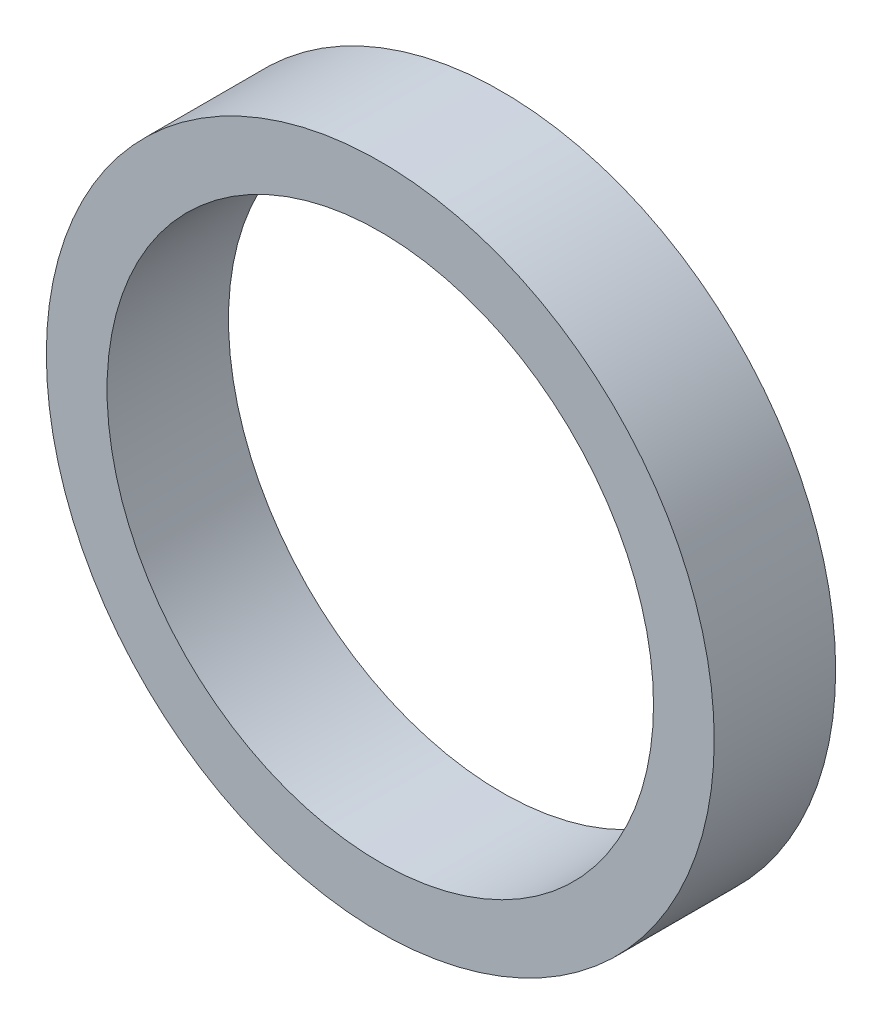
ISO-10303-21;
HEADER;
FILE_DESCRIPTION(('STEP AP214'),'2;1');
FILE_NAME('part.step','',(''),(''),'','','');
FILE_SCHEMA(('AUTOMOTIVE_DESIGN { 1 0 10303 214 1 1 1 1 }'));
ENDSEC;
DATA;
#1=APPLICATION_CONTEXT('core data for automotive mechanical design processes');
#2=APPLICATION_PROTOCOL_DEFINITION('international standard','automotive_design',2000,#1);
#3=PRODUCT_CONTEXT('',#1,'mechanical');
#4=PRODUCT('Part','Part','',(#3));
#5=PRODUCT_RELATED_PRODUCT_CATEGORY('part','',(#4));
#6=PRODUCT_DEFINITION_FORMATION('','',#4);
#7=PRODUCT_DEFINITION_CONTEXT('part definition',#1,'design');
#8=PRODUCT_DEFINITION('design','',#6,#7);
#9=PRODUCT_DEFINITION_SHAPE('','',#8);
#10=(LENGTH_UNIT() NAMED_UNIT(*) SI_UNIT(.MILLI.,.METRE.));
#11=(NAMED_UNIT(*) PLANE_ANGLE_UNIT() SI_UNIT($,.RADIAN.));
#12=(NAMED_UNIT(*) SI_UNIT($,.STERADIAN.) SOLID_ANGLE_UNIT());
#13=UNCERTAINTY_MEASURE_WITH_UNIT(LENGTH_MEASURE(1.E-05),#10,'distance_accuracy_value','');
#14=(GEOMETRIC_REPRESENTATION_CONTEXT(3) GLOBAL_UNCERTAINTY_ASSIGNED_CONTEXT((#13)) GLOBAL_UNIT_ASSIGNED_CONTEXT((#10,
#11,#12)) REPRESENTATION_CONTEXT('',''));
#15=CARTESIAN_POINT('',(0.,0.,0.));
#16=DIRECTION('',(0.,0.,1.));
#17=DIRECTION('',(1.,0.,0.));
#18=AXIS2_PLACEMENT_3D('',#15,#16,#17);
#19=CARTESIAN_POINT('',(0.,0.,12.7));
#20=DIRECTION('',(0.,0.,1.));
#21=DIRECTION('',(1.,0.,0.));
#22=AXIS2_PLACEMENT_3D('',#19,#20,#21);
#23=PLANE('',#22);
#24=CARTESIAN_POINT('',(0.,0.,12.7));
#25=DIRECTION('',(0.,0.,1.));
#26=DIRECTION('',(1.,0.,0.));
#27=AXIS2_PLACEMENT_3D('',#24,#25,#26);
#28=CIRCLE('',#27,69.85);
#29=CARTESIAN_POINT('',(69.85,0.,12.7));
#30=VERTEX_POINT('',#29);
#31=EDGE_CURVE('E10',#30,#30,#28,.T.);
#32=ORIENTED_EDGE('',*,*,#31,.T.);
#33=EDGE_LOOP('',(#32));
#34=FACE_BOUND('',#33,.T.);
#35=CARTESIAN_POINT('',(0.,0.,12.7));
#36=DIRECTION('',(0.,0.,1.));
#37=DIRECTION('',(1.,0.,0.));
#38=AXIS2_PLACEMENT_3D('',#35,#36,#37);
#39=CIRCLE('',#38,57.15);
#40=CARTESIAN_POINT('',(57.15,0.,12.7));
#41=VERTEX_POINT('',#40);
#42=EDGE_CURVE('E37',#41,#41,#39,.T.);
#43=ORIENTED_EDGE('',*,*,#42,.F.);
#44=EDGE_LOOP('',(#43));
#45=FACE_BOUND('',#44,.T.);
#46=ADVANCED_FACE('F30',(#34,#45),#23,.T.);
#47=CARTESIAN_POINT('',(0.,0.,12.7));
#48=DIRECTION('',(0.,0.,-1.));
#49=DIRECTION('',(-1.,0.,0.));
#50=AXIS2_PLACEMENT_3D('',#47,#48,#49);
#51=CYLINDRICAL_SURFACE('',#50,69.85);
#52=ORIENTED_EDGE('',*,*,#31,.F.);
#53=EDGE_LOOP('',(#52));
#54=FACE_BOUND('',#53,.T.);
#55=CARTESIAN_POINT('',(0.,0.,-12.7));
#56=DIRECTION('',(0.,0.,1.));
#57=DIRECTION('',(1.,0.,0.));
#58=AXIS2_PLACEMENT_3D('',#55,#56,#57);
#59=CIRCLE('',#58,69.85);
#60=CARTESIAN_POINT('',(69.85,0.,-12.7));
#61=VERTEX_POINT('',#60);
#62=EDGE_CURVE('E41',#61,#61,#59,.T.);
#63=ORIENTED_EDGE('',*,*,#62,.T.);
#64=EDGE_LOOP('',(#63));
#65=FACE_BOUND('',#64,.T.);
#66=ADVANCED_FACE('F32',(#54,#65),#51,.T.);
#67=CARTESIAN_POINT('',(0.,0.,12.7));
#68=DIRECTION('',(0.,0.,-1.));
#69=DIRECTION('',(-1.,0.,0.));
#70=AXIS2_PLACEMENT_3D('',#67,#68,#69);
#71=CYLINDRICAL_SURFACE('',#70,57.15);
#72=ORIENTED_EDGE('',*,*,#42,.T.);
#73=EDGE_LOOP('',(#72));
#74=FACE_BOUND('',#73,.T.);
#75=CARTESIAN_POINT('',(0.,0.,-12.7));
#76=DIRECTION('',(0.,0.,1.));
#77=DIRECTION('',(1.,0.,0.));
#78=AXIS2_PLACEMENT_3D('',#75,#76,#77);
#79=CIRCLE('',#78,57.15);
#80=CARTESIAN_POINT('',(57.15,0.,-12.7));
#81=VERTEX_POINT('',#80);
#82=EDGE_CURVE('E45',#81,#81,#79,.T.);
#83=ORIENTED_EDGE('',*,*,#82,.F.);
#84=EDGE_LOOP('',(#83));
#85=FACE_BOUND('',#84,.T.);
#86=ADVANCED_FACE('F54',(#74,#85),#71,.F.);
#87=CARTESIAN_POINT('',(0.,0.,-12.7));
#88=DIRECTION('',(0.,0.,1.));
#89=DIRECTION('',(1.,0.,0.));
#90=AXIS2_PLACEMENT_3D('',#87,#88,#89);
#91=PLANE('',#90);
#92=ORIENTED_EDGE('',*,*,#82,.T.);
#93=EDGE_LOOP('',(#92));
#94=FACE_BOUND('',#93,.T.);
#95=ORIENTED_EDGE('',*,*,#62,.F.);
#96=EDGE_LOOP('',(#95));
#97=FACE_BOUND('',#96,.T.);
#98=ADVANCED_FACE('F51',(#94,#97),#91,.F.);
#99=CLOSED_SHELL('',(#46,#66,#86,#98));
#100=MANIFOLD_SOLID_BREP('B2',#99);
#101=ADVANCED_BREP_SHAPE_REPRESENTATION('',(#18,#100),#14);
#102=SHAPE_DEFINITION_REPRESENTATION(#9,#101);
ENDSEC;
END-ISO-10303-21;
